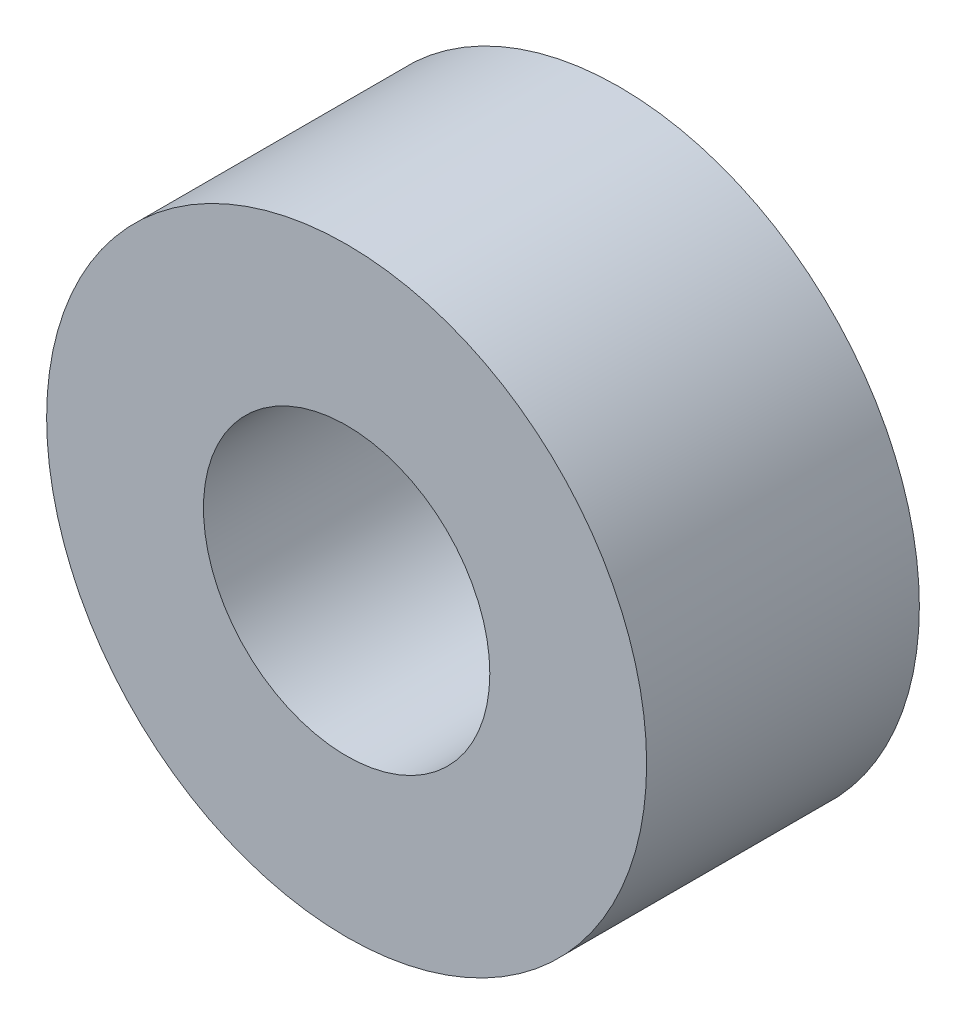
ISO-10303-21;
HEADER;
FILE_DESCRIPTION(('STEP AP214'),'2;1');
FILE_NAME('part.step','',(''),(''),'','','');
FILE_SCHEMA(('AUTOMOTIVE_DESIGN { 1 0 10303 214 1 1 1 1 }'));
ENDSEC;
DATA;
#1=APPLICATION_CONTEXT('core data for automotive mechanical design processes');
#2=APPLICATION_PROTOCOL_DEFINITION('international standard','automotive_design',2000,#1);
#3=PRODUCT_CONTEXT('',#1,'mechanical');
#4=PRODUCT('Part','Part','',(#3));
#5=PRODUCT_RELATED_PRODUCT_CATEGORY('part','',(#4));
#6=PRODUCT_DEFINITION_FORMATION('','',#4);
#7=PRODUCT_DEFINITION_CONTEXT('part definition',#1,'design');
#8=PRODUCT_DEFINITION('design','',#6,#7);
#9=PRODUCT_DEFINITION_SHAPE('','',#8);
#10=(LENGTH_UNIT() NAMED_UNIT(*) SI_UNIT(.MILLI.,.METRE.));
#11=(NAMED_UNIT(*) PLANE_ANGLE_UNIT() SI_UNIT($,.RADIAN.));
#12=(NAMED_UNIT(*) SI_UNIT($,.STERADIAN.) SOLID_ANGLE_UNIT());
#13=UNCERTAINTY_MEASURE_WITH_UNIT(LENGTH_MEASURE(1.E-05),#10,'distance_accuracy_value','');
#14=(GEOMETRIC_REPRESENTATION_CONTEXT(3) GLOBAL_UNCERTAINTY_ASSIGNED_CONTEXT((#13)) GLOBAL_UNIT_ASSIGNED_CONTEXT((#10,
#11,#12)) REPRESENTATION_CONTEXT('',''));
#15=CARTESIAN_POINT('',(0.,0.,0.));
#16=DIRECTION('',(0.,0.,1.));
#17=DIRECTION('',(1.,0.,0.));
#18=AXIS2_PLACEMENT_3D('',#15,#16,#17);
#19=CARTESIAN_POINT('',(0.,0.,4.));
#20=DIRECTION('',(0.,0.,-1.));
#21=DIRECTION('',(-1.,0.,0.));
#22=AXIS2_PLACEMENT_3D('',#19,#20,#21);
#23=CYLINDRICAL_SURFACE('',#22,4.4);
#24=CARTESIAN_POINT('',(0.,0.,4.));
#25=DIRECTION('',(0.,0.,1.));
#26=DIRECTION('',(1.,0.,0.));
#27=AXIS2_PLACEMENT_3D('',#24,#25,#26);
#28=CIRCLE('',#27,4.4);
#29=CARTESIAN_POINT('',(4.4,0.,4.));
#30=VERTEX_POINT('',#29);
#31=EDGE_CURVE('E10',#30,#30,#28,.T.);
#32=ORIENTED_EDGE('',*,*,#31,.F.);
#33=EDGE_LOOP('',(#32));
#34=FACE_BOUND('',#33,.T.);
#35=CARTESIAN_POINT('',(0.,0.,0.));
#36=DIRECTION('',(0.,0.,1.));
#37=DIRECTION('',(1.,0.,0.));
#38=AXIS2_PLACEMENT_3D('',#35,#36,#37);
#39=CIRCLE('',#38,4.4);
#40=CARTESIAN_POINT('',(4.4,0.,0.));
#41=VERTEX_POINT('',#40);
#42=EDGE_CURVE('E37',#41,#41,#39,.T.);
#43=ORIENTED_EDGE('',*,*,#42,.T.);
#44=EDGE_LOOP('',(#43));
#45=FACE_BOUND('',#44,.T.);
#46=ADVANCED_FACE('F34',(#34,#45),#23,.T.);
#47=CARTESIAN_POINT('',(0.,0.,4.));
#48=DIRECTION('',(0.,0.,1.));
#49=DIRECTION('',(1.,0.,0.));
#50=AXIS2_PLACEMENT_3D('',#47,#48,#49);
#51=PLANE('',#50);
#52=CARTESIAN_POINT('',(0.,0.,4.));
#53=DIRECTION('',(0.,0.,1.));
#54=DIRECTION('',(1.,0.,0.));
#55=AXIS2_PLACEMENT_3D('',#52,#53,#54);
#56=CIRCLE('',#55,2.1);
#57=CARTESIAN_POINT('',(2.1,0.,4.));
#58=VERTEX_POINT('',#57);
#59=EDGE_CURVE('E48',#58,#58,#56,.T.);
#60=ORIENTED_EDGE('',*,*,#59,.F.);
#61=EDGE_LOOP('',(#60));
#62=FACE_BOUND('',#61,.T.);
#63=ORIENTED_EDGE('',*,*,#31,.T.);
#64=EDGE_LOOP('',(#63));
#65=FACE_BOUND('',#64,.T.);
#66=ADVANCED_FACE('F54',(#62,#65),#51,.T.);
#67=CARTESIAN_POINT('',(0.,0.,0.));
#68=DIRECTION('',(0.,0.,1.));
#69=DIRECTION('',(1.,0.,0.));
#70=AXIS2_PLACEMENT_3D('',#67,#68,#69);
#71=PLANE('',#70);
#72=CARTESIAN_POINT('',(0.,0.,0.));
#73=DIRECTION('',(0.,0.,1.));
#74=DIRECTION('',(1.,0.,0.));
#75=AXIS2_PLACEMENT_3D('',#72,#73,#74);
#76=CIRCLE('',#75,2.1);
#77=CARTESIAN_POINT('',(2.1,0.,0.));
#78=VERTEX_POINT('',#77);
#79=EDGE_CURVE('E44',#78,#78,#76,.T.);
#80=ORIENTED_EDGE('',*,*,#79,.T.);
#81=EDGE_LOOP('',(#80));
#82=FACE_BOUND('',#81,.T.);
#83=ORIENTED_EDGE('',*,*,#42,.F.);
#84=EDGE_LOOP('',(#83));
#85=FACE_BOUND('',#84,.T.);
#86=ADVANCED_FACE('F56',(#82,#85),#71,.F.);
#87=CARTESIAN_POINT('',(0.,0.,4.));
#88=DIRECTION('',(0.,0.,1.));
#89=DIRECTION('',(1.,0.,0.));
#90=AXIS2_PLACEMENT_3D('',#87,#88,#89);
#91=CYLINDRICAL_SURFACE('',#90,2.1);
#92=ORIENTED_EDGE('',*,*,#79,.F.);
#93=EDGE_LOOP('',(#92));
#94=FACE_BOUND('',#93,.T.);
#95=ORIENTED_EDGE('',*,*,#59,.T.);
#96=EDGE_LOOP('',(#95));
#97=FACE_BOUND('',#96,.T.);
#98=ADVANCED_FACE('F52',(#94,#97),#91,.F.);
#99=CLOSED_SHELL('',(#46,#66,#86,#98));
#100=MANIFOLD_SOLID_BREP('B2',#99);
#101=ADVANCED_BREP_SHAPE_REPRESENTATION('',(#18,#100),#14);
#102=SHAPE_DEFINITION_REPRESENTATION(#9,#101);
ENDSEC;
END-ISO-10303-21;
